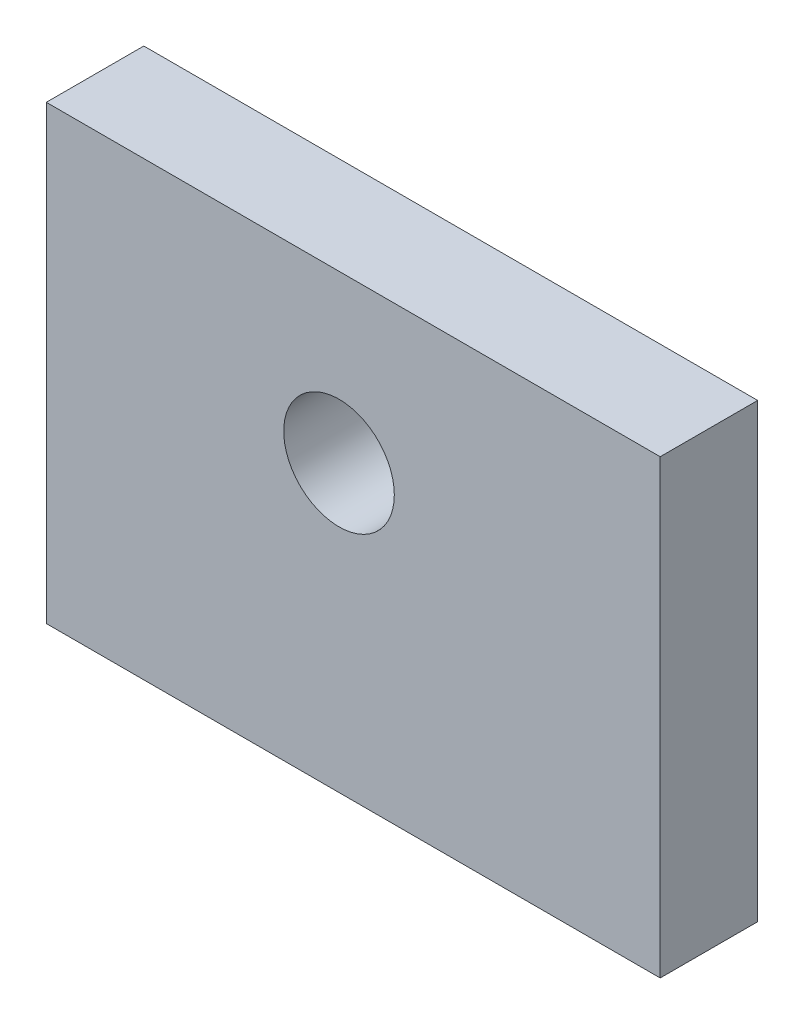
ISO-10303-21;
HEADER;
FILE_DESCRIPTION(('STEP AP214'),'2;1');
FILE_NAME('part.step','',(''),(''),'','','');
FILE_SCHEMA(('AUTOMOTIVE_DESIGN { 1 0 10303 214 1 1 1 1 }'));
ENDSEC;
DATA;
#1=APPLICATION_CONTEXT('core data for automotive mechanical design processes');
#2=APPLICATION_PROTOCOL_DEFINITION('international standard','automotive_design',2000,#1);
#3=PRODUCT_CONTEXT('',#1,'mechanical');
#4=PRODUCT('Part','Part','',(#3));
#5=PRODUCT_RELATED_PRODUCT_CATEGORY('part','',(#4));
#6=PRODUCT_DEFINITION_FORMATION('','',#4);
#7=PRODUCT_DEFINITION_CONTEXT('part definition',#1,'design');
#8=PRODUCT_DEFINITION('design','',#6,#7);
#9=PRODUCT_DEFINITION_SHAPE('','',#8);
#10=(LENGTH_UNIT() NAMED_UNIT(*) SI_UNIT(.MILLI.,.METRE.));
#11=(NAMED_UNIT(*) PLANE_ANGLE_UNIT() SI_UNIT($,.RADIAN.));
#12=(NAMED_UNIT(*) SI_UNIT($,.STERADIAN.) SOLID_ANGLE_UNIT());
#13=UNCERTAINTY_MEASURE_WITH_UNIT(LENGTH_MEASURE(1.E-05),#10,'distance_accuracy_value','');
#14=(GEOMETRIC_REPRESENTATION_CONTEXT(3) GLOBAL_UNCERTAINTY_ASSIGNED_CONTEXT((#13)) GLOBAL_UNIT_ASSIGNED_CONTEXT((#10,
#11,#12)) REPRESENTATION_CONTEXT('',''));
#15=CARTESIAN_POINT('',(0.,0.,0.));
#16=DIRECTION('',(0.,0.,1.));
#17=DIRECTION('',(1.,0.,0.));
#18=AXIS2_PLACEMENT_3D('',#15,#16,#17);
#19=CARTESIAN_POINT('',(-74.352219533921,32.1081356283344,-25.));
#20=DIRECTION('',(-1.,0.,0.));
#21=DIRECTION('',(0.,0.,1.));
#22=AXIS2_PLACEMENT_3D('',#19,#20,#21);
#23=PLANE('',#22);
#24=DIRECTION('',(0.,-1.,0.));
#25=VECTOR('',#24,1.);
#26=CARTESIAN_POINT('',(-74.352219533921,32.1081356283344,0.));
#27=LINE('',#26,#25);
#28=CARTESIAN_POINT('',(-74.352219533921,32.1081356283344,0.));
#29=VERTEX_POINT('',#28);
#30=CARTESIAN_POINT('',(-74.352219533921,-83.6665930142431,0.));
#31=VERTEX_POINT('',#30);
#32=EDGE_CURVE('E104',#29,#31,#27,.T.);
#33=ORIENTED_EDGE('',*,*,#32,.F.);
#34=DIRECTION('',(0.,0.,1.));
#35=VECTOR('',#34,1.);
#36=CARTESIAN_POINT('',(-74.352219533921,32.1081356283344,-25.));
#37=LINE('',#36,#35);
#38=CARTESIAN_POINT('',(-74.352219533921,32.1081356283344,-25.));
#39=VERTEX_POINT('',#38);
#40=EDGE_CURVE('E11',#39,#29,#37,.T.);
#41=ORIENTED_EDGE('',*,*,#40,.F.);
#42=DIRECTION('',(0.,-1.,0.));
#43=VECTOR('',#42,1.);
#44=CARTESIAN_POINT('',(-74.352219533921,32.1081356283344,-25.));
#45=LINE('',#44,#43);
#46=CARTESIAN_POINT('',(-74.352219533921,-83.6665930142431,-25.));
#47=VERTEX_POINT('',#46);
#48=EDGE_CURVE('E97',#39,#47,#45,.T.);
#49=ORIENTED_EDGE('',*,*,#48,.T.);
#50=DIRECTION('',(0.,0.,1.));
#51=VECTOR('',#50,1.);
#52=CARTESIAN_POINT('',(-74.352219533921,-83.6665930142431,-25.));
#53=LINE('',#52,#51);
#54=EDGE_CURVE('E42',#47,#31,#53,.T.);
#55=ORIENTED_EDGE('',*,*,#54,.T.);
#56=EDGE_LOOP('',(#33,#41,#49,#55));
#57=FACE_BOUND('',#56,.T.);
#58=ADVANCED_FACE('F39',(#57),#23,.T.);
#59=CARTESIAN_POINT('',(-74.352219533921,32.1081356283344,-25.));
#60=DIRECTION('',(0.,1.,0.));
#61=DIRECTION('',(0.,0.,1.));
#62=AXIS2_PLACEMENT_3D('',#59,#60,#61);
#63=PLANE('',#62);
#64=DIRECTION('',(-1.,0.,0.));
#65=VECTOR('',#64,1.);
#66=CARTESIAN_POINT('',(-74.352219533921,32.1081356283344,0.));
#67=LINE('',#66,#65);
#68=CARTESIAN_POINT('',(83.0750389026775,32.1081356283344,0.));
#69=VERTEX_POINT('',#68);
#70=EDGE_CURVE('E99',#69,#29,#67,.T.);
#71=ORIENTED_EDGE('',*,*,#70,.F.);
#72=DIRECTION('',(0.,0.,1.));
#73=VECTOR('',#72,1.);
#74=CARTESIAN_POINT('',(83.0750389026775,32.1081356283344,-25.));
#75=LINE('',#74,#73);
#76=CARTESIAN_POINT('',(83.0750389026775,32.1081356283344,-25.));
#77=VERTEX_POINT('',#76);
#78=EDGE_CURVE('E48',#77,#69,#75,.T.);
#79=ORIENTED_EDGE('',*,*,#78,.F.);
#80=DIRECTION('',(-1.,0.,0.));
#81=VECTOR('',#80,1.);
#82=CARTESIAN_POINT('',(-74.352219533921,32.1081356283344,-25.));
#83=LINE('',#82,#81);
#84=EDGE_CURVE('E94',#77,#39,#83,.T.);
#85=ORIENTED_EDGE('',*,*,#84,.T.);
#86=ORIENTED_EDGE('',*,*,#40,.T.);
#87=EDGE_LOOP('',(#71,#79,#85,#86));
#88=FACE_BOUND('',#87,.T.);
#89=ADVANCED_FACE('F115',(#88),#63,.T.);
#90=CARTESIAN_POINT('',(83.0750389026775,32.1081356283344,-25.));
#91=DIRECTION('',(1.,0.,0.));
#92=DIRECTION('',(0.,0.,-1.));
#93=AXIS2_PLACEMENT_3D('',#90,#91,#92);
#94=PLANE('',#93);
#95=DIRECTION('',(0.,1.,0.));
#96=VECTOR('',#95,1.);
#97=CARTESIAN_POINT('',(83.0750389026775,32.1081356283344,0.));
#98=LINE('',#97,#96);
#99=CARTESIAN_POINT('',(83.0750389026775,-83.6665930142431,0.));
#100=VERTEX_POINT('',#99);
#101=EDGE_CURVE('E89',#100,#69,#98,.T.);
#102=ORIENTED_EDGE('',*,*,#101,.F.);
#103=DIRECTION('',(0.,0.,1.));
#104=VECTOR('',#103,1.);
#105=CARTESIAN_POINT('',(83.0750389026775,-83.6665930142431,-25.));
#106=LINE('',#105,#104);
#107=CARTESIAN_POINT('',(83.0750389026775,-83.6665930142431,-25.));
#108=VERTEX_POINT('',#107);
#109=EDGE_CURVE('E84',#108,#100,#106,.T.);
#110=ORIENTED_EDGE('',*,*,#109,.F.);
#111=DIRECTION('',(0.,1.,0.));
#112=VECTOR('',#111,1.);
#113=CARTESIAN_POINT('',(83.0750389026775,32.1081356283344,-25.));
#114=LINE('',#113,#112);
#115=EDGE_CURVE('E87',#108,#77,#114,.T.);
#116=ORIENTED_EDGE('',*,*,#115,.T.);
#117=ORIENTED_EDGE('',*,*,#78,.T.);
#118=EDGE_LOOP('',(#102,#110,#116,#117));
#119=FACE_BOUND('',#118,.T.);
#120=ADVANCED_FACE('F86',(#119),#94,.T.);
#121=CARTESIAN_POINT('',(-74.352219533921,-83.6665930142431,-25.));
#122=DIRECTION('',(0.,-1.,0.));
#123=DIRECTION('',(0.,0.,-1.));
#124=AXIS2_PLACEMENT_3D('',#121,#122,#123);
#125=PLANE('',#124);
#126=DIRECTION('',(1.,0.,0.));
#127=VECTOR('',#126,1.);
#128=CARTESIAN_POINT('',(-74.352219533921,-83.6665930142431,0.));
#129=LINE('',#128,#127);
#130=EDGE_CURVE('E107',#31,#100,#129,.T.);
#131=ORIENTED_EDGE('',*,*,#130,.F.);
#132=ORIENTED_EDGE('',*,*,#54,.F.);
#133=DIRECTION('',(1.,0.,0.));
#134=VECTOR('',#133,1.);
#135=CARTESIAN_POINT('',(-74.352219533921,-83.6665930142431,-25.));
#136=LINE('',#135,#134);
#137=EDGE_CURVE('E93',#47,#108,#136,.T.);
#138=ORIENTED_EDGE('',*,*,#137,.T.);
#139=ORIENTED_EDGE('',*,*,#109,.T.);
#140=EDGE_LOOP('',(#131,#132,#138,#139));
#141=FACE_BOUND('',#140,.T.);
#142=ADVANCED_FACE('F96',(#141),#125,.T.);
#143=CARTESIAN_POINT('',(0.,0.,-25.));
#144=DIRECTION('',(0.,0.,1.));
#145=DIRECTION('',(1.,0.,0.));
#146=AXIS2_PLACEMENT_3D('',#143,#144,#145);
#147=PLANE('',#146);
#148=CARTESIAN_POINT('',(0.709746473262385,-10.4762819520943,-25.));
#149=DIRECTION('',(0.,0.,1.));
#150=DIRECTION('',(1.,0.,0.));
#151=AXIS2_PLACEMENT_3D('',#148,#149,#150);
#152=CIRCLE('',#151,14.1802537085464);
#153=CARTESIAN_POINT('',(14.8900001818088,-10.4762819520943,-25.));
#154=VERTEX_POINT('',#153);
#155=EDGE_CURVE('E108',#154,#154,#152,.T.);
#156=ORIENTED_EDGE('',*,*,#155,.T.);
#157=EDGE_LOOP('',(#156));
#158=FACE_BOUND('',#157,.T.);
#159=ORIENTED_EDGE('',*,*,#48,.F.);
#160=ORIENTED_EDGE('',*,*,#84,.F.);
#161=ORIENTED_EDGE('',*,*,#115,.F.);
#162=ORIENTED_EDGE('',*,*,#137,.F.);
#163=EDGE_LOOP('',(#159,#160,#161,#162));
#164=FACE_BOUND('',#163,.T.);
#165=ADVANCED_FACE('F92',(#158,#164),#147,.F.);
#166=CARTESIAN_POINT('',(0.,0.,0.));
#167=DIRECTION('',(0.,0.,1.));
#168=DIRECTION('',(1.,0.,0.));
#169=AXIS2_PLACEMENT_3D('',#166,#167,#168);
#170=PLANE('',#169);
#171=CARTESIAN_POINT('',(0.709746473262385,-10.4762819520943,0.));
#172=DIRECTION('',(0.,0.,1.));
#173=DIRECTION('',(1.,0.,0.));
#174=AXIS2_PLACEMENT_3D('',#171,#172,#173);
#175=CIRCLE('',#174,14.1802537085464);
#176=CARTESIAN_POINT('',(14.8900001818088,-10.4762819520943,0.));
#177=VERTEX_POINT('',#176);
#178=EDGE_CURVE('E145',#177,#177,#175,.T.);
#179=ORIENTED_EDGE('',*,*,#178,.F.);
#180=EDGE_LOOP('',(#179));
#181=FACE_BOUND('',#180,.T.);
#182=ORIENTED_EDGE('',*,*,#32,.T.);
#183=ORIENTED_EDGE('',*,*,#130,.T.);
#184=ORIENTED_EDGE('',*,*,#101,.T.);
#185=ORIENTED_EDGE('',*,*,#70,.T.);
#186=EDGE_LOOP('',(#182,#183,#184,#185));
#187=FACE_BOUND('',#186,.T.);
#188=ADVANCED_FACE('F114',(#181,#187),#170,.T.);
#189=CARTESIAN_POINT('',(0.709746473262385,-10.4762819520943,-25.));
#190=DIRECTION('',(0.,0.,1.));
#191=DIRECTION('',(1.,0.,0.));
#192=AXIS2_PLACEMENT_3D('',#189,#190,#191);
#193=CYLINDRICAL_SURFACE('',#192,14.1802537085464);
#194=ORIENTED_EDGE('',*,*,#155,.F.);
#195=EDGE_LOOP('',(#194));
#196=FACE_BOUND('',#195,.T.);
#197=ORIENTED_EDGE('',*,*,#178,.T.);
#198=EDGE_LOOP('',(#197));
#199=FACE_BOUND('',#198,.T.);
#200=ADVANCED_FACE('F133',(#196,#199),#193,.F.);
#201=CLOSED_SHELL('',(#58,#89,#120,#142,#165,#188,#200));
#202=MANIFOLD_SOLID_BREP('B2',#201);
#203=ADVANCED_BREP_SHAPE_REPRESENTATION('',(#18,#202),#14);
#204=SHAPE_DEFINITION_REPRESENTATION(#9,#203);
ENDSEC;
END-ISO-10303-21;
